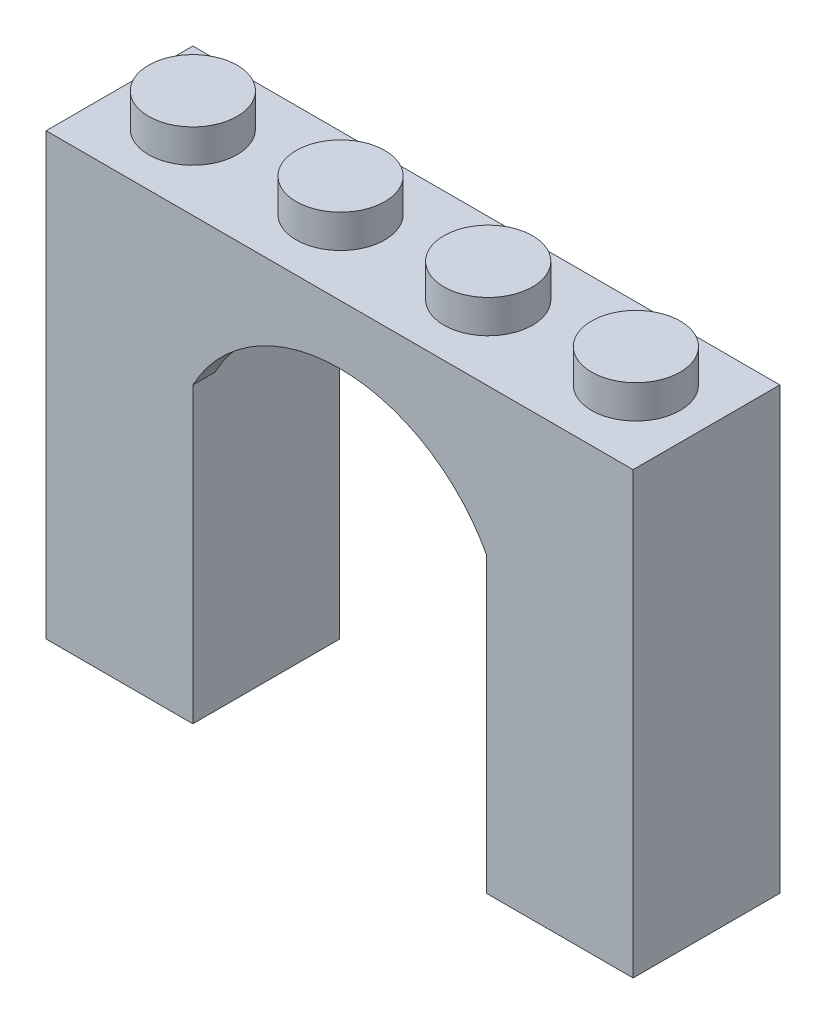
ISO-10303-21;
HEADER;
FILE_DESCRIPTION(('STEP AP214'),'2;1');
FILE_NAME('part.step','',(''),(''),'','','');
FILE_SCHEMA(('AUTOMOTIVE_DESIGN { 1 0 10303 214 1 1 1 1 }'));
ENDSEC;
DATA;
#1=APPLICATION_CONTEXT('core data for automotive mechanical design processes');
#2=APPLICATION_PROTOCOL_DEFINITION('international standard','automotive_design',2000,#1);
#3=PRODUCT_CONTEXT('',#1,'mechanical');
#4=PRODUCT('Part','Part','',(#3));
#5=PRODUCT_RELATED_PRODUCT_CATEGORY('part','',(#4));
#6=PRODUCT_DEFINITION_FORMATION('','',#4);
#7=PRODUCT_DEFINITION_CONTEXT('part definition',#1,'design');
#8=PRODUCT_DEFINITION('design','',#6,#7);
#9=PRODUCT_DEFINITION_SHAPE('','',#8);
#10=(LENGTH_UNIT() NAMED_UNIT(*) SI_UNIT(.MILLI.,.METRE.));
#11=(NAMED_UNIT(*) PLANE_ANGLE_UNIT() SI_UNIT($,.RADIAN.));
#12=(NAMED_UNIT(*) SI_UNIT($,.STERADIAN.) SOLID_ANGLE_UNIT());
#13=UNCERTAINTY_MEASURE_WITH_UNIT(LENGTH_MEASURE(1.E-05),#10,'distance_accuracy_value','');
#14=(GEOMETRIC_REPRESENTATION_CONTEXT(3) GLOBAL_UNCERTAINTY_ASSIGNED_CONTEXT((#13)) GLOBAL_UNIT_ASSIGNED_CONTEXT((#10,
#11,#12)) REPRESENTATION_CONTEXT('',''));
#15=CARTESIAN_POINT('',(0.,0.,0.));
#16=DIRECTION('',(0.,0.,1.));
#17=DIRECTION('',(1.,0.,0.));
#18=AXIS2_PLACEMENT_3D('',#15,#16,#17);
#19=CARTESIAN_POINT('',(0.,11.6221052631579,-7.95));
#20=DIRECTION('',(0.,0.,1.));
#21=DIRECTION('',(1.,0.,0.));
#22=AXIS2_PLACEMENT_3D('',#19,#20,#21);
#23=CYLINDRICAL_SURFACE('',#22,9.0278947368421);
#24=CARTESIAN_POINT('',(0.,11.6221052631579,-1.2));
#25=DIRECTION('',(0.,0.,1.));
#26=DIRECTION('',(1.,0.,0.));
#27=AXIS2_PLACEMENT_3D('',#24,#25,#26);
#28=CIRCLE('',#27,9.0278947368421);
#29=CARTESIAN_POINT('',(7.95,15.9,-1.2));
#30=VERTEX_POINT('',#29);
#31=CARTESIAN_POINT('',(-7.95,15.9,-1.2));
#32=VERTEX_POINT('',#31);
#33=EDGE_CURVE('E384',#30,#32,#28,.T.);
#34=ORIENTED_EDGE('',*,*,#33,.F.);
#35=DIRECTION('',(0.,0.,1.));
#36=VECTOR('',#35,1.);
#37=CARTESIAN_POINT('',(7.95,15.9,-7.95));
#38=LINE('',#37,#36);
#39=CARTESIAN_POINT('',(7.95,15.9,0.));
#40=VERTEX_POINT('',#39);
#41=EDGE_CURVE('E329',#30,#40,#38,.T.);
#42=ORIENTED_EDGE('',*,*,#41,.T.);
#43=CARTESIAN_POINT('',(0.,11.6221052631579,0.));
#44=DIRECTION('',(0.,0.,-1.));
#45=DIRECTION('',(-1.,0.,0.));
#46=AXIS2_PLACEMENT_3D('',#43,#44,#45);
#47=CIRCLE('',#46,9.0278947368421);
#48=CARTESIAN_POINT('',(-7.95,15.9,0.));
#49=VERTEX_POINT('',#48);
#50=EDGE_CURVE('E293',#49,#40,#47,.T.);
#51=ORIENTED_EDGE('',*,*,#50,.F.);
#52=DIRECTION('',(0.,0.,1.));
#53=VECTOR('',#52,1.);
#54=CARTESIAN_POINT('',(-7.95,15.9,-7.95));
#55=LINE('',#54,#53);
#56=EDGE_CURVE('E290',#32,#49,#55,.T.);
#57=ORIENTED_EDGE('',*,*,#56,.F.);
#58=EDGE_LOOP('',(#34,#42,#51,#57));
#59=FACE_BOUND('',#58,.T.);
#60=ADVANCED_FACE('F36',(#59),#23,.F.);
#61=CARTESIAN_POINT('',(0.,11.6221052631579,-7.95));
#62=DIRECTION('',(0.,0.,1.));
#63=DIRECTION('',(1.,0.,0.));
#64=AXIS2_PLACEMENT_3D('',#61,#62,#63);
#65=CYLINDRICAL_SURFACE('',#64,10.2278947368421);
#66=CARTESIAN_POINT('',(0.,11.6221052631579,-6.75));
#67=DIRECTION('',(0.,0.,-1.));
#68=DIRECTION('',(-1.,0.,0.));
#69=AXIS2_PLACEMENT_3D('',#66,#67,#68);
#70=CIRCLE('',#69,10.2278947368421);
#71=CARTESIAN_POINT('',(7.95,18.056958077941,-6.75));
#72=VERTEX_POINT('',#71);
#73=CARTESIAN_POINT('',(9.15,16.1923712015823,-6.75));
#74=VERTEX_POINT('',#73);
#75=EDGE_CURVE('E195',#72,#74,#70,.T.);
#76=ORIENTED_EDGE('',*,*,#75,.F.);
#77=DIRECTION('',(0.,0.,1.));
#78=VECTOR('',#77,1.);
#79=CARTESIAN_POINT('',(7.95,18.056958077941,-7.95));
#80=LINE('',#79,#78);
#81=CARTESIAN_POINT('',(7.95,18.056958077941,-1.2));
#82=VERTEX_POINT('',#81);
#83=EDGE_CURVE('E188',#72,#82,#80,.T.);
#84=ORIENTED_EDGE('',*,*,#83,.T.);
#85=CARTESIAN_POINT('',(0.,11.6221052631579,-1.2));
#86=DIRECTION('',(0.,0.,-1.));
#87=DIRECTION('',(-1.,0.,0.));
#88=AXIS2_PLACEMENT_3D('',#85,#86,#87);
#89=CIRCLE('',#88,10.2278947368421);
#90=CARTESIAN_POINT('',(9.15,16.1923712015823,-1.2));
#91=VERTEX_POINT('',#90);
#92=EDGE_CURVE('E205',#82,#91,#89,.T.);
#93=ORIENTED_EDGE('',*,*,#92,.T.);
#94=DIRECTION('',(0.,0.,1.));
#95=VECTOR('',#94,1.);
#96=CARTESIAN_POINT('',(9.15,16.1923712015823,-6.75));
#97=LINE('',#96,#95);
#98=EDGE_CURVE('E209',#74,#91,#97,.T.);
#99=ORIENTED_EDGE('',*,*,#98,.F.);
#100=EDGE_LOOP('',(#76,#84,#93,#99));
#101=FACE_BOUND('',#100,.T.);
#102=ADVANCED_FACE('F358',(#101),#65,.T.);
#103=CARTESIAN_POINT('',(-7.95,0.,-7.95));
#104=DIRECTION('',(0.,-1.,0.));
#105=DIRECTION('',(1.,0.,0.));
#106=AXIS2_PLACEMENT_3D('',#103,#104,#105);
#107=PLANE('',#106);
#108=DIRECTION('',(1.,0.,0.));
#109=VECTOR('',#108,1.);
#110=CARTESIAN_POINT('',(-7.95,0.,0.));
#111=LINE('',#110,#109);
#112=CARTESIAN_POINT('',(-15.9,0.,0.));
#113=VERTEX_POINT('',#112);
#114=CARTESIAN_POINT('',(-7.95,0.,0.));
#115=VERTEX_POINT('',#114);
#116=EDGE_CURVE('E269',#113,#115,#111,.T.);
#117=ORIENTED_EDGE('',*,*,#116,.F.);
#118=DIRECTION('',(0.,0.,1.));
#119=VECTOR('',#118,1.);
#120=CARTESIAN_POINT('',(-15.9,0.,-7.95));
#121=LINE('',#120,#119);
#122=CARTESIAN_POINT('',(-15.9,0.,-7.95));
#123=VERTEX_POINT('',#122);
#124=EDGE_CURVE('E316',#123,#113,#121,.T.);
#125=ORIENTED_EDGE('',*,*,#124,.F.);
#126=DIRECTION('',(1.,0.,0.));
#127=VECTOR('',#126,1.);
#128=CARTESIAN_POINT('',(-7.95,0.,-7.95));
#129=LINE('',#128,#127);
#130=CARTESIAN_POINT('',(-7.95,0.,-7.95));
#131=VERTEX_POINT('',#130);
#132=EDGE_CURVE('E287',#123,#131,#129,.T.);
#133=ORIENTED_EDGE('',*,*,#132,.T.);
#134=DIRECTION('',(0.,0.,1.));
#135=VECTOR('',#134,1.);
#136=CARTESIAN_POINT('',(-7.95,0.,-7.95));
#137=LINE('',#136,#135);
#138=EDGE_CURVE('E313',#131,#115,#137,.T.);
#139=ORIENTED_EDGE('',*,*,#138,.T.);
#140=EDGE_LOOP('',(#117,#125,#133,#139));
#141=FACE_BOUND('',#140,.T.);
#142=DIRECTION('',(0.,0.,1.));
#143=VECTOR('',#142,1.);
#144=CARTESIAN_POINT('',(-14.7,0.,-7.95));
#145=LINE('',#144,#143);
#146=CARTESIAN_POINT('',(-14.7,0.,-6.75));
#147=VERTEX_POINT('',#146);
#148=CARTESIAN_POINT('',(-14.7,0.,-1.2));
#149=VERTEX_POINT('',#148);
#150=EDGE_CURVE('E230',#147,#149,#145,.T.);
#151=ORIENTED_EDGE('',*,*,#150,.T.);
#152=DIRECTION('',(1.,0.,0.));
#153=VECTOR('',#152,1.);
#154=CARTESIAN_POINT('',(-7.95,0.,-1.2));
#155=LINE('',#154,#153);
#156=CARTESIAN_POINT('',(-9.15,0.,-1.2));
#157=VERTEX_POINT('',#156);
#158=EDGE_CURVE('E239',#149,#157,#155,.T.);
#159=ORIENTED_EDGE('',*,*,#158,.T.);
#160=DIRECTION('',(0.,0.,1.));
#161=VECTOR('',#160,1.);
#162=CARTESIAN_POINT('',(-9.15,0.,-7.95));
#163=LINE('',#162,#161);
#164=CARTESIAN_POINT('',(-9.15,0.,-6.75));
#165=VERTEX_POINT('',#164);
#166=EDGE_CURVE('E233',#165,#157,#163,.T.);
#167=ORIENTED_EDGE('',*,*,#166,.F.);
#168=DIRECTION('',(1.,0.,0.));
#169=VECTOR('',#168,1.);
#170=CARTESIAN_POINT('',(-7.95,0.,-6.75));
#171=LINE('',#170,#169);
#172=EDGE_CURVE('E210',#147,#165,#171,.T.);
#173=ORIENTED_EDGE('',*,*,#172,.F.);
#174=EDGE_LOOP('',(#151,#159,#167,#173));
#175=FACE_BOUND('',#174,.T.);
#176=ADVANCED_FACE('F365',(#141,#175),#107,.T.);
#177=CARTESIAN_POINT('',(7.95,0.,-7.95));
#178=DIRECTION('',(0.,-1.,0.));
#179=DIRECTION('',(1.,0.,0.));
#180=AXIS2_PLACEMENT_3D('',#177,#178,#179);
#181=PLANE('',#180);
#182=DIRECTION('',(1.,0.,0.));
#183=VECTOR('',#182,1.);
#184=CARTESIAN_POINT('',(7.95,0.,0.));
#185=LINE('',#184,#183);
#186=CARTESIAN_POINT('',(7.95,0.,0.));
#187=VERTEX_POINT('',#186);
#188=CARTESIAN_POINT('',(15.9,0.,0.));
#189=VERTEX_POINT('',#188);
#190=EDGE_CURVE('E299',#187,#189,#185,.T.);
#191=ORIENTED_EDGE('',*,*,#190,.F.);
#192=DIRECTION('',(0.,0.,1.));
#193=VECTOR('',#192,1.);
#194=CARTESIAN_POINT('',(7.95,0.,-7.95));
#195=LINE('',#194,#193);
#196=CARTESIAN_POINT('',(7.95,0.,-7.95));
#197=VERTEX_POINT('',#196);
#198=EDGE_CURVE('E324',#197,#187,#195,.T.);
#199=ORIENTED_EDGE('',*,*,#198,.F.);
#200=DIRECTION('',(1.,0.,0.));
#201=VECTOR('',#200,1.);
#202=CARTESIAN_POINT('',(7.95,0.,-7.95));
#203=LINE('',#202,#201);
#204=CARTESIAN_POINT('',(15.9,0.,-7.95));
#205=VERTEX_POINT('',#204);
#206=EDGE_CURVE('E275',#197,#205,#203,.T.);
#207=ORIENTED_EDGE('',*,*,#206,.T.);
#208=DIRECTION('',(0.,0.,1.));
#209=VECTOR('',#208,1.);
#210=CARTESIAN_POINT('',(15.9,0.,-7.95));
#211=LINE('',#210,#209);
#212=EDGE_CURVE('E322',#205,#189,#211,.T.);
#213=ORIENTED_EDGE('',*,*,#212,.T.);
#214=EDGE_LOOP('',(#191,#199,#207,#213));
#215=FACE_BOUND('',#214,.T.);
#216=DIRECTION('',(0.,0.,1.));
#217=VECTOR('',#216,1.);
#218=CARTESIAN_POINT('',(9.15,0.,-7.95));
#219=LINE('',#218,#217);
#220=CARTESIAN_POINT('',(9.15,0.,-6.75));
#221=VERTEX_POINT('',#220);
#222=CARTESIAN_POINT('',(9.15,0.,-1.2));
#223=VERTEX_POINT('',#222);
#224=EDGE_CURVE('E215',#221,#223,#219,.T.);
#225=ORIENTED_EDGE('',*,*,#224,.T.);
#226=DIRECTION('',(1.,0.,0.));
#227=VECTOR('',#226,1.);
#228=CARTESIAN_POINT('',(7.95,0.,-1.2));
#229=LINE('',#228,#227);
#230=CARTESIAN_POINT('',(14.7,0.,-1.2));
#231=VERTEX_POINT('',#230);
#232=EDGE_CURVE('E218',#223,#231,#229,.T.);
#233=ORIENTED_EDGE('',*,*,#232,.T.);
#234=DIRECTION('',(0.,0.,1.));
#235=VECTOR('',#234,1.);
#236=CARTESIAN_POINT('',(14.7,0.,-7.95));
#237=LINE('',#236,#235);
#238=CARTESIAN_POINT('',(14.7,0.,-6.75));
#239=VERTEX_POINT('',#238);
#240=EDGE_CURVE('E245',#239,#231,#237,.T.);
#241=ORIENTED_EDGE('',*,*,#240,.F.);
#242=DIRECTION('',(1.,0.,0.));
#243=VECTOR('',#242,1.);
#244=CARTESIAN_POINT('',(7.95,0.,-6.75));
#245=LINE('',#244,#243);
#246=EDGE_CURVE('E198',#221,#239,#245,.T.);
#247=ORIENTED_EDGE('',*,*,#246,.F.);
#248=EDGE_LOOP('',(#225,#233,#241,#247));
#249=FACE_BOUND('',#248,.T.);
#250=ADVANCED_FACE('F423',(#215,#249),#181,.T.);
#251=CARTESIAN_POINT('',(12.,25.65,-4.05));
#252=DIRECTION('',(0.,1.,0.));
#253=DIRECTION('',(0.,0.,1.));
#254=AXIS2_PLACEMENT_3D('',#251,#252,#253);
#255=PLANE('',#254);
#256=CARTESIAN_POINT('',(12.,25.65,-4.05));
#257=DIRECTION('',(0.,1.,0.));
#258=DIRECTION('',(0.,0.,1.));
#259=AXIS2_PLACEMENT_3D('',#256,#257,#258);
#260=CIRCLE('',#259,2.4);
#261=CARTESIAN_POINT('',(12.,25.65,-1.65));
#262=VERTEX_POINT('',#261);
#263=EDGE_CURVE('E11',#262,#262,#260,.T.);
#264=ORIENTED_EDGE('',*,*,#263,.T.);
#265=EDGE_LOOP('',(#264));
#266=FACE_BOUND('',#265,.T.);
#267=ADVANCED_FACE('F38',(#266),#255,.T.);
#268=CARTESIAN_POINT('',(12.,25.65,-4.05));
#269=DIRECTION('',(0.,-1.,0.));
#270=DIRECTION('',(0.,0.,-1.));
#271=AXIS2_PLACEMENT_3D('',#268,#269,#270);
#272=CYLINDRICAL_SURFACE('',#271,2.4);
#273=ORIENTED_EDGE('',*,*,#263,.F.);
#274=EDGE_LOOP('',(#273));
#275=FACE_BOUND('',#274,.T.);
#276=CARTESIAN_POINT('',(12.,23.85,-4.05));
#277=DIRECTION('',(0.,1.,0.));
#278=DIRECTION('',(0.,0.,1.));
#279=AXIS2_PLACEMENT_3D('',#276,#277,#278);
#280=CIRCLE('',#279,2.4);
#281=CARTESIAN_POINT('',(12.,23.85,-1.65));
#282=VERTEX_POINT('',#281);
#283=EDGE_CURVE('E44',#282,#282,#280,.T.);
#284=ORIENTED_EDGE('',*,*,#283,.T.);
#285=EDGE_LOOP('',(#284));
#286=FACE_BOUND('',#285,.T.);
#287=ADVANCED_FACE('F338',(#275,#286),#272,.T.);
#288=CARTESIAN_POINT('',(4.,25.65,-4.05));
#289=DIRECTION('',(0.,1.,0.));
#290=DIRECTION('',(0.,0.,1.));
#291=AXIS2_PLACEMENT_3D('',#288,#289,#290);
#292=PLANE('',#291);
#293=CARTESIAN_POINT('',(4.,25.65,-4.05));
#294=DIRECTION('',(0.,1.,0.));
#295=DIRECTION('',(0.,0.,1.));
#296=AXIS2_PLACEMENT_3D('',#293,#294,#295);
#297=CIRCLE('',#296,2.4);
#298=CARTESIAN_POINT('',(4.,25.65,-1.65));
#299=VERTEX_POINT('',#298);
#300=EDGE_CURVE('E333',#299,#299,#297,.T.);
#301=ORIENTED_EDGE('',*,*,#300,.T.);
#302=EDGE_LOOP('',(#301));
#303=FACE_BOUND('',#302,.T.);
#304=ADVANCED_FACE('F557',(#303),#292,.T.);
#305=CARTESIAN_POINT('',(4.,25.65,-4.05));
#306=DIRECTION('',(0.,-1.,0.));
#307=DIRECTION('',(0.,0.,-1.));
#308=AXIS2_PLACEMENT_3D('',#305,#306,#307);
#309=CYLINDRICAL_SURFACE('',#308,2.4);
#310=ORIENTED_EDGE('',*,*,#300,.F.);
#311=EDGE_LOOP('',(#310));
#312=FACE_BOUND('',#311,.T.);
#313=CARTESIAN_POINT('',(4.,23.85,-4.05));
#314=DIRECTION('',(0.,1.,0.));
#315=DIRECTION('',(0.,0.,1.));
#316=AXIS2_PLACEMENT_3D('',#313,#314,#315);
#317=CIRCLE('',#316,2.4);
#318=CARTESIAN_POINT('',(4.,23.85,-1.65));
#319=VERTEX_POINT('',#318);
#320=EDGE_CURVE('E315',#319,#319,#317,.T.);
#321=ORIENTED_EDGE('',*,*,#320,.T.);
#322=EDGE_LOOP('',(#321));
#323=FACE_BOUND('',#322,.T.);
#324=ADVANCED_FACE('F555',(#312,#323),#309,.T.);
#325=CARTESIAN_POINT('',(-7.95,0.,-7.95));
#326=DIRECTION('',(1.,0.,0.));
#327=DIRECTION('',(0.,0.,-1.));
#328=AXIS2_PLACEMENT_3D('',#325,#326,#327);
#329=PLANE('',#328);
#330=CARTESIAN_POINT('',(-7.95,15.9,-7.95));
#331=VERTEX_POINT('',#330);
#332=CARTESIAN_POINT('',(-7.95,15.9,-6.75));
#333=VERTEX_POINT('',#332);
#334=EDGE_CURVE('E177',#331,#333,#55,.T.);
#335=ORIENTED_EDGE('',*,*,#334,.T.);
#336=DIRECTION('',(0.,1.,0.));
#337=VECTOR('',#336,1.);
#338=CARTESIAN_POINT('',(-7.95,0.,-6.75));
#339=LINE('',#338,#337);
#340=CARTESIAN_POINT('',(-7.95,18.056958077941,-6.75));
#341=VERTEX_POINT('',#340);
#342=EDGE_CURVE('E51',#333,#341,#339,.T.);
#343=ORIENTED_EDGE('',*,*,#342,.T.);
#344=DIRECTION('',(0.,0.,1.));
#345=VECTOR('',#344,1.);
#346=CARTESIAN_POINT('',(-7.95,18.056958077941,-7.95));
#347=LINE('',#346,#345);
#348=CARTESIAN_POINT('',(-7.95,18.056958077941,-1.2));
#349=VERTEX_POINT('',#348);
#350=EDGE_CURVE('E174',#349,#341,#347,.F.);
#351=ORIENTED_EDGE('',*,*,#350,.F.);
#352=DIRECTION('',(0.,1.,0.));
#353=VECTOR('',#352,1.);
#354=CARTESIAN_POINT('',(-7.95,0.,-1.2));
#355=LINE('',#354,#353);
#356=EDGE_CURVE('E178',#32,#349,#355,.T.);
#357=ORIENTED_EDGE('',*,*,#356,.F.);
#358=ORIENTED_EDGE('',*,*,#56,.T.);
#359=DIRECTION('',(0.,1.,0.));
#360=VECTOR('',#359,1.);
#361=CARTESIAN_POINT('',(-7.95,0.,0.));
#362=LINE('',#361,#360);
#363=EDGE_CURVE('E263',#115,#49,#362,.T.);
#364=ORIENTED_EDGE('',*,*,#363,.F.);
#365=ORIENTED_EDGE('',*,*,#138,.F.);
#366=DIRECTION('',(0.,1.,0.));
#367=VECTOR('',#366,1.);
#368=CARTESIAN_POINT('',(-7.95,0.,-7.95));
#369=LINE('',#368,#367);
#370=EDGE_CURVE('E266',#131,#331,#369,.T.);
#371=ORIENTED_EDGE('',*,*,#370,.T.);
#372=EDGE_LOOP('',(#335,#343,#351,#357,#358,#364,#365,#371));
#373=FACE_BOUND('',#372,.T.);
#374=ADVANCED_FACE('F172',(#373),#329,.T.);
#375=CARTESIAN_POINT('',(-15.9,0.,-7.95));
#376=DIRECTION('',(-1.,0.,0.));
#377=DIRECTION('',(0.,0.,1.));
#378=AXIS2_PLACEMENT_3D('',#375,#376,#377);
#379=PLANE('',#378);
#380=DIRECTION('',(0.,-1.,0.));
#381=VECTOR('',#380,1.);
#382=CARTESIAN_POINT('',(-15.9,0.,0.));
#383=LINE('',#382,#381);
#384=CARTESIAN_POINT('',(-15.9,23.85,0.));
#385=VERTEX_POINT('',#384);
#386=EDGE_CURVE('E308',#385,#113,#383,.T.);
#387=ORIENTED_EDGE('',*,*,#386,.F.);
#388=DIRECTION('',(0.,0.,1.));
#389=VECTOR('',#388,1.);
#390=CARTESIAN_POINT('',(-15.9,23.85,-7.95));
#391=LINE('',#390,#389);
#392=CARTESIAN_POINT('',(-15.9,23.85,-7.95));
#393=VERTEX_POINT('',#392);
#394=EDGE_CURVE('E318',#393,#385,#391,.T.);
#395=ORIENTED_EDGE('',*,*,#394,.F.);
#396=DIRECTION('',(0.,-1.,0.));
#397=VECTOR('',#396,1.);
#398=CARTESIAN_POINT('',(-15.9,0.,-7.95));
#399=LINE('',#398,#397);
#400=EDGE_CURVE('E284',#393,#123,#399,.T.);
#401=ORIENTED_EDGE('',*,*,#400,.T.);
#402=ORIENTED_EDGE('',*,*,#124,.T.);
#403=EDGE_LOOP('',(#387,#395,#401,#402));
#404=FACE_BOUND('',#403,.T.);
#405=ADVANCED_FACE('F343',(#404),#379,.T.);
#406=CARTESIAN_POINT('',(-15.9,23.85,-7.95));
#407=DIRECTION('',(0.,1.,0.));
#408=DIRECTION('',(0.,0.,1.));
#409=AXIS2_PLACEMENT_3D('',#406,#407,#408);
#410=PLANE('',#409);
#411=CARTESIAN_POINT('',(-4.,23.85,-4.05));
#412=DIRECTION('',(0.,1.,0.));
#413=DIRECTION('',(0.,0.,1.));
#414=AXIS2_PLACEMENT_3D('',#411,#412,#413);
#415=CIRCLE('',#414,2.4);
#416=CARTESIAN_POINT('',(-4.,23.85,-1.65));
#417=VERTEX_POINT('',#416);
#418=EDGE_CURVE('E252',#417,#417,#415,.T.);
#419=ORIENTED_EDGE('',*,*,#418,.F.);
#420=EDGE_LOOP('',(#419));
#421=FACE_BOUND('',#420,.T.);
#422=CARTESIAN_POINT('',(-12.,23.85,-4.05));
#423=DIRECTION('',(0.,1.,0.));
#424=DIRECTION('',(0.,0.,1.));
#425=AXIS2_PLACEMENT_3D('',#422,#423,#424);
#426=CIRCLE('',#425,2.4);
#427=CARTESIAN_POINT('',(-12.,23.85,-1.65));
#428=VERTEX_POINT('',#427);
#429=EDGE_CURVE('E259',#428,#428,#426,.T.);
#430=ORIENTED_EDGE('',*,*,#429,.F.);
#431=EDGE_LOOP('',(#430));
#432=FACE_BOUND('',#431,.T.);
#433=DIRECTION('',(-1.,0.,0.));
#434=VECTOR('',#433,1.);
#435=CARTESIAN_POINT('',(-15.9,23.85,0.));
#436=LINE('',#435,#434);
#437=CARTESIAN_POINT('',(15.9,23.85,0.));
#438=VERTEX_POINT('',#437);
#439=EDGE_CURVE('E305',#438,#385,#436,.T.);
#440=ORIENTED_EDGE('',*,*,#439,.F.);
#441=DIRECTION('',(0.,0.,1.));
#442=VECTOR('',#441,1.);
#443=CARTESIAN_POINT('',(15.9,23.85,-7.95));
#444=LINE('',#443,#442);
#445=CARTESIAN_POINT('',(15.9,23.85,-7.95));
#446=VERTEX_POINT('',#445);
#447=EDGE_CURVE('E320',#446,#438,#444,.T.);
#448=ORIENTED_EDGE('',*,*,#447,.F.);
#449=DIRECTION('',(-1.,0.,0.));
#450=VECTOR('',#449,1.);
#451=CARTESIAN_POINT('',(-15.9,23.85,-7.95));
#452=LINE('',#451,#450);
#453=EDGE_CURVE('E281',#446,#393,#452,.T.);
#454=ORIENTED_EDGE('',*,*,#453,.T.);
#455=ORIENTED_EDGE('',*,*,#394,.T.);
#456=EDGE_LOOP('',(#440,#448,#454,#455));
#457=FACE_BOUND('',#456,.T.);
#458=ORIENTED_EDGE('',*,*,#320,.F.);
#459=EDGE_LOOP('',(#458));
#460=FACE_BOUND('',#459,.T.);
#461=ORIENTED_EDGE('',*,*,#283,.F.);
#462=EDGE_LOOP('',(#461));
#463=FACE_BOUND('',#462,.T.);
#464=ADVANCED_FACE('F340',(#421,#432,#457,#460,#463),#410,.T.);
#465=CARTESIAN_POINT('',(15.9,0.,-7.95));
#466=DIRECTION('',(1.,0.,0.));
#467=DIRECTION('',(0.,0.,-1.));
#468=AXIS2_PLACEMENT_3D('',#465,#466,#467);
#469=PLANE('',#468);
#470=DIRECTION('',(0.,1.,0.));
#471=VECTOR('',#470,1.);
#472=CARTESIAN_POINT('',(15.9,0.,0.));
#473=LINE('',#472,#471);
#474=EDGE_CURVE('E302',#189,#438,#473,.T.);
#475=ORIENTED_EDGE('',*,*,#474,.F.);
#476=ORIENTED_EDGE('',*,*,#212,.F.);
#477=DIRECTION('',(0.,1.,0.));
#478=VECTOR('',#477,1.);
#479=CARTESIAN_POINT('',(15.9,0.,-7.95));
#480=LINE('',#479,#478);
#481=EDGE_CURVE('E278',#205,#446,#480,.T.);
#482=ORIENTED_EDGE('',*,*,#481,.T.);
#483=ORIENTED_EDGE('',*,*,#447,.T.);
#484=EDGE_LOOP('',(#475,#476,#482,#483));
#485=FACE_BOUND('',#484,.T.);
#486=ADVANCED_FACE('F342',(#485),#469,.T.);
#487=CARTESIAN_POINT('',(7.95,0.,-7.95));
#488=DIRECTION('',(-1.,0.,0.));
#489=DIRECTION('',(0.,0.,1.));
#490=AXIS2_PLACEMENT_3D('',#487,#488,#489);
#491=PLANE('',#490);
#492=ORIENTED_EDGE('',*,*,#198,.T.);
#493=DIRECTION('',(0.,-1.,0.));
#494=VECTOR('',#493,1.);
#495=CARTESIAN_POINT('',(7.95,0.,0.));
#496=LINE('',#495,#494);
#497=EDGE_CURVE('E296',#40,#187,#496,.T.);
#498=ORIENTED_EDGE('',*,*,#497,.F.);
#499=ORIENTED_EDGE('',*,*,#41,.F.);
#500=DIRECTION('',(0.,1.,0.));
#501=VECTOR('',#500,1.);
#502=CARTESIAN_POINT('',(7.95,0.,-1.2));
#503=LINE('',#502,#501);
#504=EDGE_CURVE('E189',#30,#82,#503,.T.);
#505=ORIENTED_EDGE('',*,*,#504,.T.);
#506=ORIENTED_EDGE('',*,*,#83,.F.);
#507=DIRECTION('',(0.,1.,0.));
#508=VECTOR('',#507,1.);
#509=CARTESIAN_POINT('',(7.95,0.,-6.75));
#510=LINE('',#509,#508);
#511=CARTESIAN_POINT('',(7.95,15.9,-6.75));
#512=VERTEX_POINT('',#511);
#513=EDGE_CURVE('E57',#512,#72,#510,.T.);
#514=ORIENTED_EDGE('',*,*,#513,.F.);
#515=CARTESIAN_POINT('',(7.95,15.9,-7.95));
#516=VERTEX_POINT('',#515);
#517=EDGE_CURVE('E326',#516,#512,#38,.T.);
#518=ORIENTED_EDGE('',*,*,#517,.F.);
#519=DIRECTION('',(0.,-1.,0.));
#520=VECTOR('',#519,1.);
#521=CARTESIAN_POINT('',(7.95,0.,-7.95));
#522=LINE('',#521,#520);
#523=EDGE_CURVE('E272',#516,#197,#522,.T.);
#524=ORIENTED_EDGE('',*,*,#523,.T.);
#525=EDGE_LOOP('',(#492,#498,#499,#505,#506,#514,#518,#524));
#526=FACE_BOUND('',#525,.T.);
#527=ADVANCED_FACE('F350',(#526),#491,.T.);
#528=CARTESIAN_POINT('',(0.,11.6221052631579,-6.75));
#529=DIRECTION('',(0.,0.,-1.));
#530=DIRECTION('',(-1.,0.,0.));
#531=AXIS2_PLACEMENT_3D('',#528,#529,#530);
#532=CIRCLE('',#531,9.0278947368421);
#533=EDGE_CURVE('E382',#333,#512,#532,.T.);
#534=ORIENTED_EDGE('',*,*,#533,.F.);
#535=ORIENTED_EDGE('',*,*,#334,.F.);
#536=CARTESIAN_POINT('',(0.,11.6221052631579,-7.95));
#537=DIRECTION('',(0.,0.,-1.));
#538=DIRECTION('',(-1.,0.,0.));
#539=AXIS2_PLACEMENT_3D('',#536,#537,#538);
#540=CIRCLE('',#539,9.0278947368421);
#541=EDGE_CURVE('E268',#331,#516,#540,.T.);
#542=ORIENTED_EDGE('',*,*,#541,.T.);
#543=ORIENTED_EDGE('',*,*,#517,.T.);
#544=EDGE_LOOP('',(#534,#535,#542,#543));
#545=FACE_BOUND('',#544,.T.);
#546=ADVANCED_FACE('F361',(#545),#23,.F.);
#547=CARTESIAN_POINT('',(0.,11.6221052631579,-7.95));
#548=DIRECTION('',(0.,0.,-1.));
#549=DIRECTION('',(-1.,0.,0.));
#550=AXIS2_PLACEMENT_3D('',#547,#548,#549);
#551=PLANE('',#550);
#552=ORIENTED_EDGE('',*,*,#370,.F.);
#553=ORIENTED_EDGE('',*,*,#132,.F.);
#554=ORIENTED_EDGE('',*,*,#400,.F.);
#555=ORIENTED_EDGE('',*,*,#453,.F.);
#556=ORIENTED_EDGE('',*,*,#481,.F.);
#557=ORIENTED_EDGE('',*,*,#206,.F.);
#558=ORIENTED_EDGE('',*,*,#523,.F.);
#559=ORIENTED_EDGE('',*,*,#541,.F.);
#560=EDGE_LOOP('',(#552,#553,#554,#555,#556,#557,#558,#559));
#561=FACE_BOUND('',#560,.T.);
#562=ADVANCED_FACE('F372',(#561),#551,.T.);
#563=CARTESIAN_POINT('',(0.,11.6221052631579,0.));
#564=DIRECTION('',(0.,0.,-1.));
#565=DIRECTION('',(-1.,0.,0.));
#566=AXIS2_PLACEMENT_3D('',#563,#564,#565);
#567=PLANE('',#566);
#568=ORIENTED_EDGE('',*,*,#363,.T.);
#569=ORIENTED_EDGE('',*,*,#50,.T.);
#570=ORIENTED_EDGE('',*,*,#497,.T.);
#571=ORIENTED_EDGE('',*,*,#190,.T.);
#572=ORIENTED_EDGE('',*,*,#474,.T.);
#573=ORIENTED_EDGE('',*,*,#439,.T.);
#574=ORIENTED_EDGE('',*,*,#386,.T.);
#575=ORIENTED_EDGE('',*,*,#116,.T.);
#576=EDGE_LOOP('',(#568,#569,#570,#571,#572,#573,#574,#575));
#577=FACE_BOUND('',#576,.T.);
#578=ADVANCED_FACE('F378',(#577),#567,.F.);
#579=CARTESIAN_POINT('',(-12.,25.65,-4.05));
#580=DIRECTION('',(0.,-1.,0.));
#581=DIRECTION('',(0.,0.,-1.));
#582=AXIS2_PLACEMENT_3D('',#579,#580,#581);
#583=CYLINDRICAL_SURFACE('',#582,2.4);
#584=CARTESIAN_POINT('',(-12.,25.65,-4.05));
#585=DIRECTION('',(0.,1.,0.));
#586=DIRECTION('',(0.,0.,1.));
#587=AXIS2_PLACEMENT_3D('',#584,#585,#586);
#588=CIRCLE('',#587,2.4);
#589=CARTESIAN_POINT('',(-12.,25.65,-1.65));
#590=VERTEX_POINT('',#589);
#591=EDGE_CURVE('E260',#590,#590,#588,.T.);
#592=ORIENTED_EDGE('',*,*,#591,.F.);
#593=EDGE_LOOP('',(#592));
#594=FACE_BOUND('',#593,.T.);
#595=ORIENTED_EDGE('',*,*,#429,.T.);
#596=EDGE_LOOP('',(#595));
#597=FACE_BOUND('',#596,.T.);
#598=ADVANCED_FACE('F528',(#594,#597),#583,.T.);
#599=CARTESIAN_POINT('',(-12.,25.65,-4.05));
#600=DIRECTION('',(0.,1.,0.));
#601=DIRECTION('',(0.,0.,1.));
#602=AXIS2_PLACEMENT_3D('',#599,#600,#601);
#603=PLANE('',#602);
#604=ORIENTED_EDGE('',*,*,#591,.T.);
#605=EDGE_LOOP('',(#604));
#606=FACE_BOUND('',#605,.T.);
#607=ADVANCED_FACE('F524',(#606),#603,.T.);
#608=CARTESIAN_POINT('',(-4.,25.65,-4.05));
#609=DIRECTION('',(0.,-1.,0.));
#610=DIRECTION('',(0.,0.,-1.));
#611=AXIS2_PLACEMENT_3D('',#608,#609,#610);
#612=CYLINDRICAL_SURFACE('',#611,2.4);
#613=CARTESIAN_POINT('',(-4.,25.65,-4.05));
#614=DIRECTION('',(0.,1.,0.));
#615=DIRECTION('',(0.,0.,1.));
#616=AXIS2_PLACEMENT_3D('',#613,#614,#615);
#617=CIRCLE('',#616,2.4);
#618=CARTESIAN_POINT('',(-4.,25.65,-1.65));
#619=VERTEX_POINT('',#618);
#620=EDGE_CURVE('E255',#619,#619,#617,.T.);
#621=ORIENTED_EDGE('',*,*,#620,.F.);
#622=EDGE_LOOP('',(#621));
#623=FACE_BOUND('',#622,.T.);
#624=ORIENTED_EDGE('',*,*,#418,.T.);
#625=EDGE_LOOP('',(#624));
#626=FACE_BOUND('',#625,.T.);
#627=ADVANCED_FACE('F520',(#623,#626),#612,.T.);
#628=CARTESIAN_POINT('',(-4.,25.65,-4.05));
#629=DIRECTION('',(0.,1.,0.));
#630=DIRECTION('',(0.,0.,1.));
#631=AXIS2_PLACEMENT_3D('',#628,#629,#630);
#632=PLANE('',#631);
#633=ORIENTED_EDGE('',*,*,#620,.T.);
#634=EDGE_LOOP('',(#633));
#635=FACE_BOUND('',#634,.T.);
#636=ADVANCED_FACE('F482',(#635),#632,.T.);
#637=CARTESIAN_POINT('',(12.,24.45,-4.05));
#638=DIRECTION('',(0.,1.,0.));
#639=DIRECTION('',(0.,0.,1.));
#640=AXIS2_PLACEMENT_3D('',#637,#638,#639);
#641=PLANE('',#640);
#642=CARTESIAN_POINT('',(12.,24.45,-4.05));
#643=DIRECTION('',(0.,1.,0.));
#644=DIRECTION('',(0.,0.,1.));
#645=AXIS2_PLACEMENT_3D('',#642,#643,#644);
#646=CIRCLE('',#645,1.2);
#647=CARTESIAN_POINT('',(12.,24.45,-2.85));
#648=VERTEX_POINT('',#647);
#649=EDGE_CURVE('E256',#648,#648,#646,.T.);
#650=ORIENTED_EDGE('',*,*,#649,.F.);
#651=EDGE_LOOP('',(#650));
#652=FACE_BOUND('',#651,.T.);
#653=ADVANCED_FACE('F472',(#652),#641,.F.);
#654=CARTESIAN_POINT('',(12.,25.65,-4.05));
#655=DIRECTION('',(0.,-1.,0.));
#656=DIRECTION('',(0.,0.,-1.));
#657=AXIS2_PLACEMENT_3D('',#654,#655,#656);
#658=CYLINDRICAL_SURFACE('',#657,1.2);
#659=ORIENTED_EDGE('',*,*,#649,.T.);
#660=EDGE_LOOP('',(#659));
#661=FACE_BOUND('',#660,.T.);
#662=CARTESIAN_POINT('',(12.,22.65,-4.05));
#663=DIRECTION('',(0.,1.,0.));
#664=DIRECTION('',(0.,0.,1.));
#665=AXIS2_PLACEMENT_3D('',#662,#663,#664);
#666=CIRCLE('',#665,1.2);
#667=CARTESIAN_POINT('',(12.,22.65,-2.85));
#668=VERTEX_POINT('',#667);
#669=EDGE_CURVE('E392',#668,#668,#666,.T.);
#670=ORIENTED_EDGE('',*,*,#669,.F.);
#671=EDGE_LOOP('',(#670));
#672=FACE_BOUND('',#671,.T.);
#673=ADVANCED_FACE('F469',(#661,#672),#658,.F.);
#674=CARTESIAN_POINT('',(4.,24.45,-4.05));
#675=DIRECTION('',(0.,1.,0.));
#676=DIRECTION('',(0.,0.,1.));
#677=AXIS2_PLACEMENT_3D('',#674,#675,#676);
#678=PLANE('',#677);
#679=CARTESIAN_POINT('',(4.,24.45,-4.05));
#680=DIRECTION('',(0.,1.,0.));
#681=DIRECTION('',(0.,0.,1.));
#682=AXIS2_PLACEMENT_3D('',#679,#680,#681);
#683=CIRCLE('',#682,1.2);
#684=CARTESIAN_POINT('',(4.,24.45,-2.85));
#685=VERTEX_POINT('',#684);
#686=EDGE_CURVE('E395',#685,#685,#683,.T.);
#687=ORIENTED_EDGE('',*,*,#686,.F.);
#688=EDGE_LOOP('',(#687));
#689=FACE_BOUND('',#688,.T.);
#690=ADVANCED_FACE('F471',(#689),#678,.F.);
#691=CARTESIAN_POINT('',(4.,25.65,-4.05));
#692=DIRECTION('',(0.,-1.,0.));
#693=DIRECTION('',(0.,0.,-1.));
#694=AXIS2_PLACEMENT_3D('',#691,#692,#693);
#695=CYLINDRICAL_SURFACE('',#694,1.2);
#696=ORIENTED_EDGE('',*,*,#686,.T.);
#697=EDGE_LOOP('',(#696));
#698=FACE_BOUND('',#697,.T.);
#699=CARTESIAN_POINT('',(4.,22.65,-4.05));
#700=DIRECTION('',(0.,1.,0.));
#701=DIRECTION('',(0.,0.,1.));
#702=AXIS2_PLACEMENT_3D('',#699,#700,#701);
#703=CIRCLE('',#702,1.2);
#704=CARTESIAN_POINT('',(4.,22.65,-2.85));
#705=VERTEX_POINT('',#704);
#706=EDGE_CURVE('E238',#705,#705,#703,.T.);
#707=ORIENTED_EDGE('',*,*,#706,.F.);
#708=EDGE_LOOP('',(#707));
#709=FACE_BOUND('',#708,.T.);
#710=ADVANCED_FACE('F479',(#698,#709),#695,.F.);
#711=CARTESIAN_POINT('',(-9.15,0.,-7.95));
#712=DIRECTION('',(1.,0.,0.));
#713=DIRECTION('',(0.,0.,-1.));
#714=AXIS2_PLACEMENT_3D('',#711,#712,#713);
#715=PLANE('',#714);
#716=DIRECTION('',(0.,1.,0.));
#717=VECTOR('',#716,1.);
#718=CARTESIAN_POINT('',(-9.15,0.,-1.2));
#719=LINE('',#718,#717);
#720=CARTESIAN_POINT('',(-9.15,16.1923712015823,-1.2));
#721=VERTEX_POINT('',#720);
#722=EDGE_CURVE('E202',#157,#721,#719,.T.);
#723=ORIENTED_EDGE('',*,*,#722,.T.);
#724=DIRECTION('',(0.,0.,1.));
#725=VECTOR('',#724,1.);
#726=CARTESIAN_POINT('',(-9.15,16.1923712015823,-6.75));
#727=LINE('',#726,#725);
#728=CARTESIAN_POINT('',(-9.15,16.1923712015823,-6.75));
#729=VERTEX_POINT('',#728);
#730=EDGE_CURVE('E207',#729,#721,#727,.T.);
#731=ORIENTED_EDGE('',*,*,#730,.F.);
#732=DIRECTION('',(0.,1.,0.));
#733=VECTOR('',#732,1.);
#734=CARTESIAN_POINT('',(-9.15,0.,-6.75));
#735=LINE('',#734,#733);
#736=EDGE_CURVE('E193',#165,#729,#735,.T.);
#737=ORIENTED_EDGE('',*,*,#736,.F.);
#738=ORIENTED_EDGE('',*,*,#166,.T.);
#739=EDGE_LOOP('',(#723,#731,#737,#738));
#740=FACE_BOUND('',#739,.T.);
#741=ADVANCED_FACE('F450',(#740),#715,.F.);
#742=CARTESIAN_POINT('',(-14.7,0.,-7.95));
#743=DIRECTION('',(-1.,0.,0.));
#744=DIRECTION('',(0.,0.,1.));
#745=AXIS2_PLACEMENT_3D('',#742,#743,#744);
#746=PLANE('',#745);
#747=DIRECTION('',(0.,-1.,0.));
#748=VECTOR('',#747,1.);
#749=CARTESIAN_POINT('',(-14.7,0.,-1.2));
#750=LINE('',#749,#748);
#751=CARTESIAN_POINT('',(-14.7,22.65,-1.2));
#752=VERTEX_POINT('',#751);
#753=EDGE_CURVE('E242',#752,#149,#750,.T.);
#754=ORIENTED_EDGE('',*,*,#753,.T.);
#755=ORIENTED_EDGE('',*,*,#150,.F.);
#756=DIRECTION('',(0.,-1.,0.));
#757=VECTOR('',#756,1.);
#758=CARTESIAN_POINT('',(-14.7,0.,-6.75));
#759=LINE('',#758,#757);
#760=CARTESIAN_POINT('',(-14.7,22.65,-6.75));
#761=VERTEX_POINT('',#760);
#762=EDGE_CURVE('E236',#761,#147,#759,.T.);
#763=ORIENTED_EDGE('',*,*,#762,.F.);
#764=DIRECTION('',(0.,0.,1.));
#765=VECTOR('',#764,1.);
#766=CARTESIAN_POINT('',(-14.7,22.65,-7.95));
#767=LINE('',#766,#765);
#768=EDGE_CURVE('E234',#761,#752,#767,.T.);
#769=ORIENTED_EDGE('',*,*,#768,.T.);
#770=EDGE_LOOP('',(#754,#755,#763,#769));
#771=FACE_BOUND('',#770,.T.);
#772=ADVANCED_FACE('F455',(#771),#746,.F.);
#773=CARTESIAN_POINT('',(-15.9,22.65,-7.95));
#774=DIRECTION('',(0.,1.,0.));
#775=DIRECTION('',(0.,0.,1.));
#776=AXIS2_PLACEMENT_3D('',#773,#774,#775);
#777=PLANE('',#776);
#778=CARTESIAN_POINT('',(-12.,22.65,-4.05));
#779=DIRECTION('',(0.,1.,0.));
#780=DIRECTION('',(0.,0.,1.));
#781=AXIS2_PLACEMENT_3D('',#778,#779,#780);
#782=CIRCLE('',#781,1.2);
#783=CARTESIAN_POINT('',(-12.,22.65,-2.85));
#784=VERTEX_POINT('',#783);
#785=EDGE_CURVE('E225',#784,#784,#782,.T.);
#786=ORIENTED_EDGE('',*,*,#785,.T.);
#787=EDGE_LOOP('',(#786));
#788=FACE_BOUND('',#787,.T.);
#789=ORIENTED_EDGE('',*,*,#768,.F.);
#790=DIRECTION('',(-1.,0.,0.));
#791=VECTOR('',#790,1.);
#792=CARTESIAN_POINT('',(-15.9,22.65,-6.75));
#793=LINE('',#792,#791);
#794=CARTESIAN_POINT('',(14.7,22.65,-6.75));
#795=VERTEX_POINT('',#794);
#796=EDGE_CURVE('E402',#795,#761,#793,.T.);
#797=ORIENTED_EDGE('',*,*,#796,.F.);
#798=DIRECTION('',(0.,0.,1.));
#799=VECTOR('',#798,1.);
#800=CARTESIAN_POINT('',(14.7,22.65,-7.95));
#801=LINE('',#800,#799);
#802=CARTESIAN_POINT('',(14.7,22.65,-1.2));
#803=VERTEX_POINT('',#802);
#804=EDGE_CURVE('E247',#795,#803,#801,.T.);
#805=ORIENTED_EDGE('',*,*,#804,.T.);
#806=DIRECTION('',(-1.,0.,0.));
#807=VECTOR('',#806,1.);
#808=CARTESIAN_POINT('',(-15.9,22.65,-1.2));
#809=LINE('',#808,#807);
#810=EDGE_CURVE('E222',#803,#752,#809,.T.);
#811=ORIENTED_EDGE('',*,*,#810,.T.);
#812=EDGE_LOOP('',(#789,#797,#805,#811));
#813=FACE_BOUND('',#812,.T.);
#814=CARTESIAN_POINT('',(-4.,22.65,-4.05));
#815=DIRECTION('',(0.,1.,0.));
#816=DIRECTION('',(0.,0.,1.));
#817=AXIS2_PLACEMENT_3D('',#814,#815,#816);
#818=CIRCLE('',#817,1.2);
#819=CARTESIAN_POINT('',(-4.,22.65,-2.85));
#820=VERTEX_POINT('',#819);
#821=EDGE_CURVE('E229',#820,#820,#818,.T.);
#822=ORIENTED_EDGE('',*,*,#821,.T.);
#823=EDGE_LOOP('',(#822));
#824=FACE_BOUND('',#823,.T.);
#825=ORIENTED_EDGE('',*,*,#706,.T.);
#826=EDGE_LOOP('',(#825));
#827=FACE_BOUND('',#826,.T.);
#828=ORIENTED_EDGE('',*,*,#669,.T.);
#829=EDGE_LOOP('',(#828));
#830=FACE_BOUND('',#829,.T.);
#831=ADVANCED_FACE('F458',(#788,#813,#824,#827,#830),#777,.F.);
#832=CARTESIAN_POINT('',(14.7,0.,-7.95));
#833=DIRECTION('',(1.,0.,0.));
#834=DIRECTION('',(0.,0.,-1.));
#835=AXIS2_PLACEMENT_3D('',#832,#833,#834);
#836=PLANE('',#835);
#837=DIRECTION('',(0.,1.,0.));
#838=VECTOR('',#837,1.);
#839=CARTESIAN_POINT('',(14.7,0.,-1.2));
#840=LINE('',#839,#838);
#841=EDGE_CURVE('E219',#231,#803,#840,.T.);
#842=ORIENTED_EDGE('',*,*,#841,.T.);
#843=ORIENTED_EDGE('',*,*,#804,.F.);
#844=DIRECTION('',(0.,1.,0.));
#845=VECTOR('',#844,1.);
#846=CARTESIAN_POINT('',(14.7,0.,-6.75));
#847=LINE('',#846,#845);
#848=EDGE_CURVE('E244',#239,#795,#847,.T.);
#849=ORIENTED_EDGE('',*,*,#848,.F.);
#850=ORIENTED_EDGE('',*,*,#240,.T.);
#851=EDGE_LOOP('',(#842,#843,#849,#850));
#852=FACE_BOUND('',#851,.T.);
#853=ADVANCED_FACE('F420',(#852),#836,.F.);
#854=CARTESIAN_POINT('',(9.15,0.,-7.95));
#855=DIRECTION('',(-1.,0.,0.));
#856=DIRECTION('',(0.,0.,1.));
#857=AXIS2_PLACEMENT_3D('',#854,#855,#856);
#858=PLANE('',#857);
#859=DIRECTION('',(0.,-1.,0.));
#860=VECTOR('',#859,1.);
#861=CARTESIAN_POINT('',(9.15,0.,-1.2));
#862=LINE('',#861,#860);
#863=EDGE_CURVE('E212',#91,#223,#862,.T.);
#864=ORIENTED_EDGE('',*,*,#863,.T.);
#865=ORIENTED_EDGE('',*,*,#224,.F.);
#866=DIRECTION('',(0.,-1.,0.));
#867=VECTOR('',#866,1.);
#868=CARTESIAN_POINT('',(9.15,0.,-6.75));
#869=LINE('',#868,#867);
#870=EDGE_CURVE('E194',#74,#221,#869,.T.);
#871=ORIENTED_EDGE('',*,*,#870,.F.);
#872=ORIENTED_EDGE('',*,*,#98,.T.);
#873=EDGE_LOOP('',(#864,#865,#871,#872));
#874=FACE_BOUND('',#873,.T.);
#875=ADVANCED_FACE('F431',(#874),#858,.F.);
#876=EDGE_CURVE('E187',#721,#349,#89,.T.);
#877=ORIENTED_EDGE('',*,*,#876,.T.);
#878=ORIENTED_EDGE('',*,*,#350,.T.);
#879=EDGE_CURVE('E184',#729,#341,#70,.T.);
#880=ORIENTED_EDGE('',*,*,#879,.F.);
#881=ORIENTED_EDGE('',*,*,#730,.T.);
#882=EDGE_LOOP('',(#877,#878,#880,#881));
#883=FACE_BOUND('',#882,.T.);
#884=ADVANCED_FACE('F183',(#883),#65,.T.);
#885=CARTESIAN_POINT('',(0.,11.6221052631579,-6.75));
#886=DIRECTION('',(0.,0.,-1.));
#887=DIRECTION('',(-1.,0.,0.));
#888=AXIS2_PLACEMENT_3D('',#885,#886,#887);
#889=PLANE('',#888);
#890=ORIENTED_EDGE('',*,*,#879,.T.);
#891=ORIENTED_EDGE('',*,*,#342,.F.);
#892=ORIENTED_EDGE('',*,*,#533,.T.);
#893=ORIENTED_EDGE('',*,*,#513,.T.);
#894=ORIENTED_EDGE('',*,*,#75,.T.);
#895=ORIENTED_EDGE('',*,*,#870,.T.);
#896=ORIENTED_EDGE('',*,*,#246,.T.);
#897=ORIENTED_EDGE('',*,*,#848,.T.);
#898=ORIENTED_EDGE('',*,*,#796,.T.);
#899=ORIENTED_EDGE('',*,*,#762,.T.);
#900=ORIENTED_EDGE('',*,*,#172,.T.);
#901=ORIENTED_EDGE('',*,*,#736,.T.);
#902=EDGE_LOOP('',(#890,#891,#892,#893,#894,#895,#896,#897,#898,#899,#900,#901));
#903=FACE_BOUND('',#902,.T.);
#904=ADVANCED_FACE('F191',(#903),#889,.F.);
#905=CARTESIAN_POINT('',(0.,11.6221052631579,-1.2));
#906=DIRECTION('',(0.,0.,-1.));
#907=DIRECTION('',(-1.,0.,0.));
#908=AXIS2_PLACEMENT_3D('',#905,#906,#907);
#909=PLANE('',#908);
#910=ORIENTED_EDGE('',*,*,#753,.F.);
#911=ORIENTED_EDGE('',*,*,#810,.F.);
#912=ORIENTED_EDGE('',*,*,#841,.F.);
#913=ORIENTED_EDGE('',*,*,#232,.F.);
#914=ORIENTED_EDGE('',*,*,#863,.F.);
#915=ORIENTED_EDGE('',*,*,#92,.F.);
#916=ORIENTED_EDGE('',*,*,#504,.F.);
#917=ORIENTED_EDGE('',*,*,#33,.T.);
#918=ORIENTED_EDGE('',*,*,#356,.T.);
#919=ORIENTED_EDGE('',*,*,#876,.F.);
#920=ORIENTED_EDGE('',*,*,#722,.F.);
#921=ORIENTED_EDGE('',*,*,#158,.F.);
#922=EDGE_LOOP('',(#910,#911,#912,#913,#914,#915,#916,#917,#918,#919,#920,#921));
#923=FACE_BOUND('',#922,.T.);
#924=ADVANCED_FACE('F427',(#923),#909,.T.);
#925=CARTESIAN_POINT('',(-12.,25.65,-4.05));
#926=DIRECTION('',(0.,-1.,0.));
#927=DIRECTION('',(0.,0.,-1.));
#928=AXIS2_PLACEMENT_3D('',#925,#926,#927);
#929=CYLINDRICAL_SURFACE('',#928,1.2);
#930=CARTESIAN_POINT('',(-12.,24.45,-4.05));
#931=DIRECTION('',(0.,1.,0.));
#932=DIRECTION('',(0.,0.,1.));
#933=AXIS2_PLACEMENT_3D('',#930,#931,#932);
#934=CIRCLE('',#933,1.2);
#935=CARTESIAN_POINT('',(-12.,24.45,-2.85));
#936=VERTEX_POINT('',#935);
#937=EDGE_CURVE('E206',#936,#936,#934,.T.);
#938=ORIENTED_EDGE('',*,*,#937,.T.);
#939=EDGE_LOOP('',(#938));
#940=FACE_BOUND('',#939,.T.);
#941=ORIENTED_EDGE('',*,*,#785,.F.);
#942=EDGE_LOOP('',(#941));
#943=FACE_BOUND('',#942,.T.);
#944=ADVANCED_FACE('F502',(#940,#943),#929,.F.);
#945=CARTESIAN_POINT('',(-12.,24.45,-4.05));
#946=DIRECTION('',(0.,1.,0.));
#947=DIRECTION('',(0.,0.,1.));
#948=AXIS2_PLACEMENT_3D('',#945,#946,#947);
#949=PLANE('',#948);
#950=ORIENTED_EDGE('',*,*,#937,.F.);
#951=EDGE_LOOP('',(#950));
#952=FACE_BOUND('',#951,.T.);
#953=ADVANCED_FACE('F505',(#952),#949,.F.);
#954=CARTESIAN_POINT('',(-4.,25.65,-4.05));
#955=DIRECTION('',(0.,-1.,0.));
#956=DIRECTION('',(0.,0.,-1.));
#957=AXIS2_PLACEMENT_3D('',#954,#955,#956);
#958=CYLINDRICAL_SURFACE('',#957,1.2);
#959=CARTESIAN_POINT('',(-4.,24.45,-4.05));
#960=DIRECTION('',(0.,1.,0.));
#961=DIRECTION('',(0.,0.,1.));
#962=AXIS2_PLACEMENT_3D('',#959,#960,#961);
#963=CIRCLE('',#962,1.2);
#964=CARTESIAN_POINT('',(-4.,24.45,-2.85));
#965=VERTEX_POINT('',#964);
#966=EDGE_CURVE('E226',#965,#965,#963,.T.);
#967=ORIENTED_EDGE('',*,*,#966,.T.);
#968=EDGE_LOOP('',(#967));
#969=FACE_BOUND('',#968,.T.);
#970=ORIENTED_EDGE('',*,*,#821,.F.);
#971=EDGE_LOOP('',(#970));
#972=FACE_BOUND('',#971,.T.);
#973=ADVANCED_FACE('F509',(#969,#972),#958,.F.);
#974=CARTESIAN_POINT('',(-4.,24.45,-4.05));
#975=DIRECTION('',(0.,1.,0.));
#976=DIRECTION('',(0.,0.,1.));
#977=AXIS2_PLACEMENT_3D('',#974,#975,#976);
#978=PLANE('',#977);
#979=ORIENTED_EDGE('',*,*,#966,.F.);
#980=EDGE_LOOP('',(#979));
#981=FACE_BOUND('',#980,.T.);
#982=ADVANCED_FACE('F513',(#981),#978,.F.);
#983=CLOSED_SHELL('',(#60,#102,#176,#250,#267,#287,#304,#324,#374,#405,#464,#486,#527,#546,#562,
#578,#598,#607,#627,#636,#653,#673,#690,#710,#741,#772,#831,#853,#875,#884,#904,#924,#944,#953,
#973,#982));
#984=MANIFOLD_SOLID_BREP('B2',#983);
#985=ADVANCED_BREP_SHAPE_REPRESENTATION('',(#18,#984),#14);
#986=SHAPE_DEFINITION_REPRESENTATION(#9,#985);
ENDSEC;
END-ISO-10303-21;
